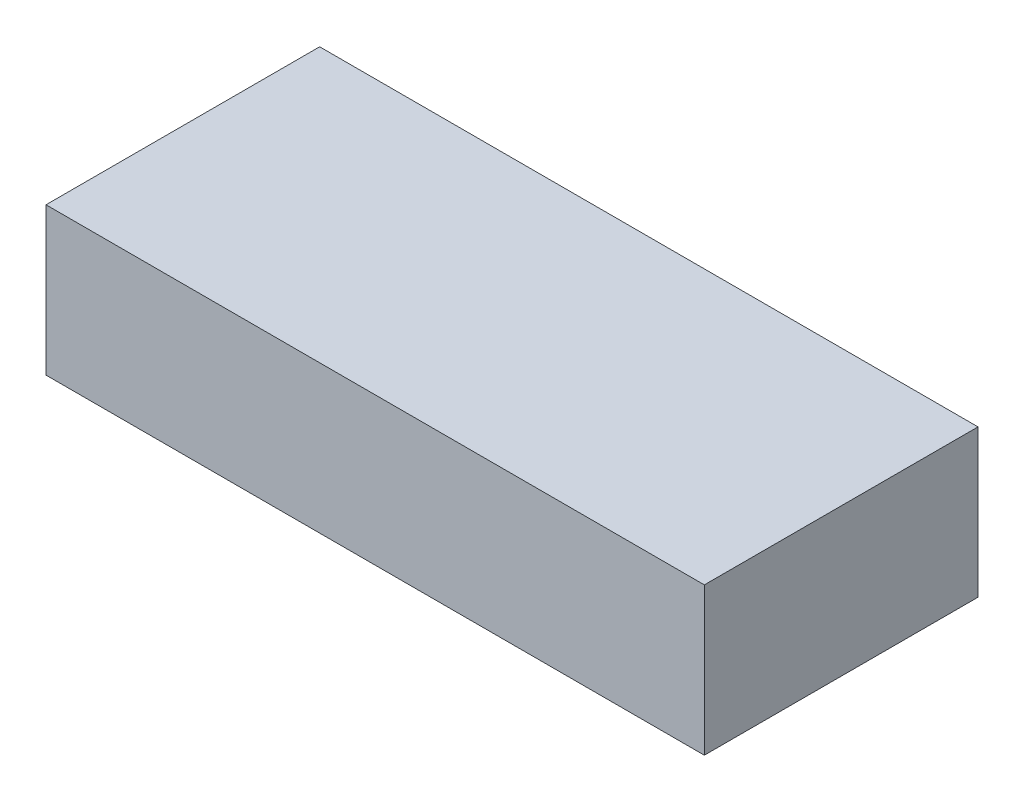
ISO-10303-21;
HEADER;
FILE_DESCRIPTION(('STEP AP214'),'2;1');
FILE_NAME('part.step','',(''),(''),'','','');
FILE_SCHEMA(('AUTOMOTIVE_DESIGN { 1 0 10303 214 1 1 1 1 }'));
ENDSEC;
DATA;
#1=APPLICATION_CONTEXT('core data for automotive mechanical design processes');
#2=APPLICATION_PROTOCOL_DEFINITION('international standard','automotive_design',2000,#1);
#3=PRODUCT_CONTEXT('',#1,'mechanical');
#4=PRODUCT('Part','Part','',(#3));
#5=PRODUCT_RELATED_PRODUCT_CATEGORY('part','',(#4));
#6=PRODUCT_DEFINITION_FORMATION('','',#4);
#7=PRODUCT_DEFINITION_CONTEXT('part definition',#1,'design');
#8=PRODUCT_DEFINITION('design','',#6,#7);
#9=PRODUCT_DEFINITION_SHAPE('','',#8);
#10=(LENGTH_UNIT() NAMED_UNIT(*) SI_UNIT(.MILLI.,.METRE.));
#11=(NAMED_UNIT(*) PLANE_ANGLE_UNIT() SI_UNIT($,.RADIAN.));
#12=(NAMED_UNIT(*) SI_UNIT($,.STERADIAN.) SOLID_ANGLE_UNIT());
#13=UNCERTAINTY_MEASURE_WITH_UNIT(LENGTH_MEASURE(1.E-05),#10,'distance_accuracy_value','');
#14=(GEOMETRIC_REPRESENTATION_CONTEXT(3) GLOBAL_UNCERTAINTY_ASSIGNED_CONTEXT((#13)) GLOBAL_UNIT_ASSIGNED_CONTEXT((#10,
#11,#12)) REPRESENTATION_CONTEXT('',''));
#15=CARTESIAN_POINT('',(0.,0.,0.));
#16=DIRECTION('',(0.,0.,1.));
#17=DIRECTION('',(1.,0.,0.));
#18=AXIS2_PLACEMENT_3D('',#15,#16,#17);
#19=CARTESIAN_POINT('',(0.,18.6,0.));
#20=DIRECTION('',(1.,0.,0.));
#21=DIRECTION('',(0.,0.,-1.));
#22=AXIS2_PLACEMENT_3D('',#19,#20,#21);
#23=PLANE('',#22);
#24=DIRECTION('',(0.,0.,1.));
#25=VECTOR('',#24,1.);
#26=CARTESIAN_POINT('',(0.,0.,0.));
#27=LINE('',#26,#25);
#28=CARTESIAN_POINT('',(0.,0.,-34.5));
#29=VERTEX_POINT('',#28);
#30=CARTESIAN_POINT('',(0.,0.,0.));
#31=VERTEX_POINT('',#30);
#32=EDGE_CURVE('E96',#29,#31,#27,.T.);
#33=ORIENTED_EDGE('',*,*,#32,.T.);
#34=DIRECTION('',(0.,-1.,0.));
#35=VECTOR('',#34,1.);
#36=CARTESIAN_POINT('',(0.,18.6,0.));
#37=LINE('',#36,#35);
#38=CARTESIAN_POINT('',(0.,18.6,0.));
#39=VERTEX_POINT('',#38);
#40=EDGE_CURVE('E11',#39,#31,#37,.T.);
#41=ORIENTED_EDGE('',*,*,#40,.F.);
#42=DIRECTION('',(0.,0.,1.));
#43=VECTOR('',#42,1.);
#44=CARTESIAN_POINT('',(0.,18.6,0.));
#45=LINE('',#44,#43);
#46=CARTESIAN_POINT('',(0.,18.6,-34.5));
#47=VERTEX_POINT('',#46);
#48=EDGE_CURVE('E84',#47,#39,#45,.T.);
#49=ORIENTED_EDGE('',*,*,#48,.F.);
#50=DIRECTION('',(0.,-1.,0.));
#51=VECTOR('',#50,1.);
#52=CARTESIAN_POINT('',(0.,18.6,-34.5));
#53=LINE('',#52,#51);
#54=EDGE_CURVE('E92',#47,#29,#53,.T.);
#55=ORIENTED_EDGE('',*,*,#54,.T.);
#56=EDGE_LOOP('',(#33,#41,#49,#55));
#57=FACE_BOUND('',#56,.T.);
#58=ADVANCED_FACE('F33',(#57),#23,.F.);
#59=CARTESIAN_POINT('',(0.,18.6,0.));
#60=DIRECTION('',(0.,0.,-1.));
#61=DIRECTION('',(-1.,0.,0.));
#62=AXIS2_PLACEMENT_3D('',#59,#60,#61);
#63=PLANE('',#62);
#64=DIRECTION('',(1.,0.,0.));
#65=VECTOR('',#64,1.);
#66=CARTESIAN_POINT('',(0.,0.,0.));
#67=LINE('',#66,#65);
#68=CARTESIAN_POINT('',(83.,0.,0.));
#69=VERTEX_POINT('',#68);
#70=EDGE_CURVE('E88',#31,#69,#67,.T.);
#71=ORIENTED_EDGE('',*,*,#70,.T.);
#72=DIRECTION('',(0.,-1.,0.));
#73=VECTOR('',#72,1.);
#74=CARTESIAN_POINT('',(83.,18.6,0.));
#75=LINE('',#74,#73);
#76=CARTESIAN_POINT('',(83.,18.6,0.));
#77=VERTEX_POINT('',#76);
#78=EDGE_CURVE('E41',#77,#69,#75,.T.);
#79=ORIENTED_EDGE('',*,*,#78,.F.);
#80=DIRECTION('',(1.,0.,0.));
#81=VECTOR('',#80,1.);
#82=CARTESIAN_POINT('',(0.,18.6,0.));
#83=LINE('',#82,#81);
#84=EDGE_CURVE('E79',#39,#77,#83,.T.);
#85=ORIENTED_EDGE('',*,*,#84,.F.);
#86=ORIENTED_EDGE('',*,*,#40,.T.);
#87=EDGE_LOOP('',(#71,#79,#85,#86));
#88=FACE_BOUND('',#87,.T.);
#89=ADVANCED_FACE('F87',(#88),#63,.F.);
#90=CARTESIAN_POINT('',(83.,18.6,0.));
#91=DIRECTION('',(-1.,0.,0.));
#92=DIRECTION('',(0.,0.,1.));
#93=AXIS2_PLACEMENT_3D('',#90,#91,#92);
#94=PLANE('',#93);
#95=DIRECTION('',(0.,0.,-1.));
#96=VECTOR('',#95,1.);
#97=CARTESIAN_POINT('',(83.,0.,0.));
#98=LINE('',#97,#96);
#99=CARTESIAN_POINT('',(83.,0.,-34.5));
#100=VERTEX_POINT('',#99);
#101=EDGE_CURVE('E66',#69,#100,#98,.T.);
#102=ORIENTED_EDGE('',*,*,#101,.T.);
#103=DIRECTION('',(0.,-1.,0.));
#104=VECTOR('',#103,1.);
#105=CARTESIAN_POINT('',(83.,18.6,-34.5));
#106=LINE('',#105,#104);
#107=CARTESIAN_POINT('',(83.,18.6,-34.5));
#108=VERTEX_POINT('',#107);
#109=EDGE_CURVE('E89',#108,#100,#106,.T.);
#110=ORIENTED_EDGE('',*,*,#109,.F.);
#111=DIRECTION('',(0.,0.,-1.));
#112=VECTOR('',#111,1.);
#113=CARTESIAN_POINT('',(83.,18.6,0.));
#114=LINE('',#113,#112);
#115=EDGE_CURVE('E82',#77,#108,#114,.T.);
#116=ORIENTED_EDGE('',*,*,#115,.F.);
#117=ORIENTED_EDGE('',*,*,#78,.T.);
#118=EDGE_LOOP('',(#102,#110,#116,#117));
#119=FACE_BOUND('',#118,.T.);
#120=ADVANCED_FACE('F90',(#119),#94,.F.);
#121=CARTESIAN_POINT('',(0.,18.6,-34.5));
#122=DIRECTION('',(0.,0.,1.));
#123=DIRECTION('',(1.,0.,0.));
#124=AXIS2_PLACEMENT_3D('',#121,#122,#123);
#125=PLANE('',#124);
#126=DIRECTION('',(-1.,0.,0.));
#127=VECTOR('',#126,1.);
#128=CARTESIAN_POINT('',(0.,0.,-34.5));
#129=LINE('',#128,#127);
#130=EDGE_CURVE('E72',#100,#29,#129,.T.);
#131=ORIENTED_EDGE('',*,*,#130,.T.);
#132=ORIENTED_EDGE('',*,*,#54,.F.);
#133=DIRECTION('',(-1.,0.,0.));
#134=VECTOR('',#133,1.);
#135=CARTESIAN_POINT('',(0.,18.6,-34.5));
#136=LINE('',#135,#134);
#137=EDGE_CURVE('E49',#108,#47,#136,.T.);
#138=ORIENTED_EDGE('',*,*,#137,.F.);
#139=ORIENTED_EDGE('',*,*,#109,.T.);
#140=EDGE_LOOP('',(#131,#132,#138,#139));
#141=FACE_BOUND('',#140,.T.);
#142=ADVANCED_FACE('F103',(#141),#125,.F.);
#143=CARTESIAN_POINT('',(0.,18.6,0.));
#144=DIRECTION('',(0.,-1.,0.));
#145=DIRECTION('',(0.,0.,-1.));
#146=AXIS2_PLACEMENT_3D('',#143,#144,#145);
#147=PLANE('',#146);
#148=ORIENTED_EDGE('',*,*,#48,.T.);
#149=ORIENTED_EDGE('',*,*,#84,.T.);
#150=ORIENTED_EDGE('',*,*,#115,.T.);
#151=ORIENTED_EDGE('',*,*,#137,.T.);
#152=EDGE_LOOP('',(#148,#149,#150,#151));
#153=FACE_BOUND('',#152,.T.);
#154=ADVANCED_FACE('F80',(#153),#147,.F.);
#155=CARTESIAN_POINT('',(0.,0.,0.));
#156=DIRECTION('',(0.,-1.,0.));
#157=DIRECTION('',(0.,0.,-1.));
#158=AXIS2_PLACEMENT_3D('',#155,#156,#157);
#159=PLANE('',#158);
#160=ORIENTED_EDGE('',*,*,#32,.F.);
#161=ORIENTED_EDGE('',*,*,#130,.F.);
#162=ORIENTED_EDGE('',*,*,#101,.F.);
#163=ORIENTED_EDGE('',*,*,#70,.F.);
#164=EDGE_LOOP('',(#160,#161,#162,#163));
#165=FACE_BOUND('',#164,.T.);
#166=ADVANCED_FACE('F106',(#165),#159,.T.);
#167=CLOSED_SHELL('',(#58,#89,#120,#142,#154,#166));
#168=MANIFOLD_SOLID_BREP('B2',#167);
#169=ADVANCED_BREP_SHAPE_REPRESENTATION('',(#18,#168),#14);
#170=SHAPE_DEFINITION_REPRESENTATION(#9,#169);
ENDSEC;
END-ISO-10303-21;
